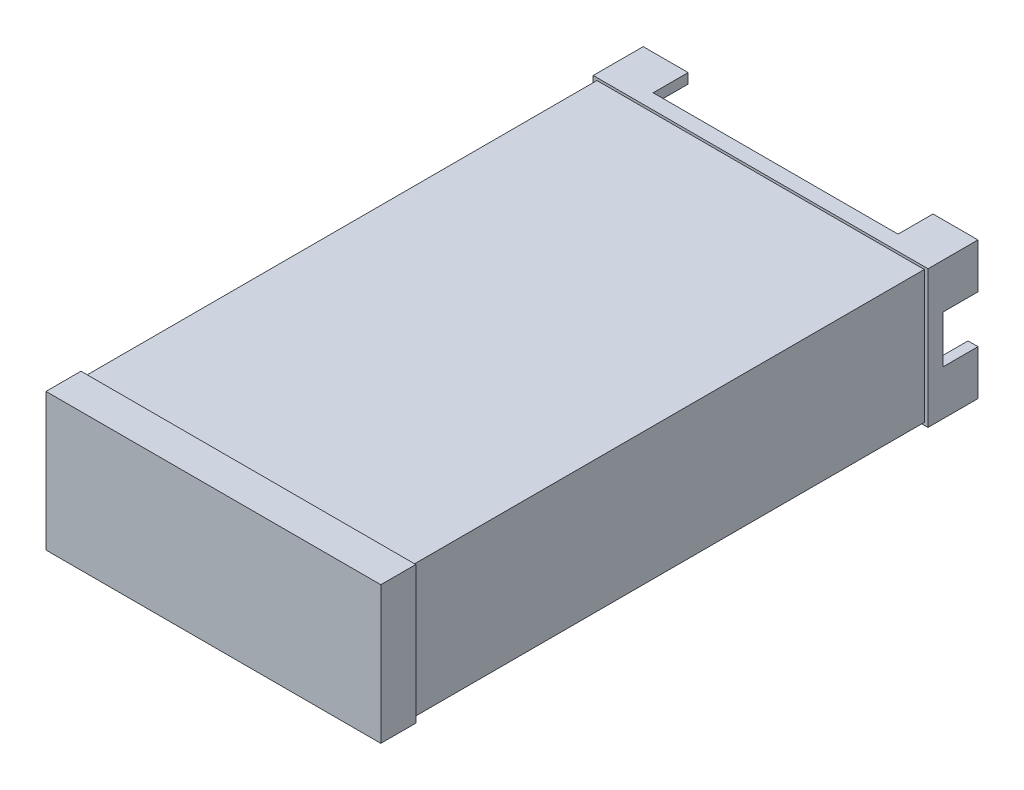
ISO-10303-21;
HEADER;
FILE_DESCRIPTION(('STEP AP214'),'2;1');
FILE_NAME('part.step','',(''),(''),'','','');
FILE_SCHEMA(('AUTOMOTIVE_DESIGN { 1 0 10303 214 1 1 1 1 }'));
ENDSEC;
DATA;
#1=APPLICATION_CONTEXT('core data for automotive mechanical design processes');
#2=APPLICATION_PROTOCOL_DEFINITION('international standard','automotive_design',2000,#1);
#3=PRODUCT_CONTEXT('',#1,'mechanical');
#4=PRODUCT('Part','Part','',(#3));
#5=PRODUCT_RELATED_PRODUCT_CATEGORY('part','',(#4));
#6=PRODUCT_DEFINITION_FORMATION('','',#4);
#7=PRODUCT_DEFINITION_CONTEXT('part definition',#1,'design');
#8=PRODUCT_DEFINITION('design','',#6,#7);
#9=PRODUCT_DEFINITION_SHAPE('','',#8);
#10=(LENGTH_UNIT() NAMED_UNIT(*) SI_UNIT(.MILLI.,.METRE.));
#11=(NAMED_UNIT(*) PLANE_ANGLE_UNIT() SI_UNIT($,.RADIAN.));
#12=(NAMED_UNIT(*) SI_UNIT($,.STERADIAN.) SOLID_ANGLE_UNIT());
#13=UNCERTAINTY_MEASURE_WITH_UNIT(LENGTH_MEASURE(1.E-05),#10,'distance_accuracy_value','');
#14=(GEOMETRIC_REPRESENTATION_CONTEXT(3) GLOBAL_UNCERTAINTY_ASSIGNED_CONTEXT((#13)) GLOBAL_UNIT_ASSIGNED_CONTEXT((#10,
#11,#12)) REPRESENTATION_CONTEXT('',''));
#15=CARTESIAN_POINT('',(0.,0.,0.));
#16=DIRECTION('',(0.,0.,1.));
#17=DIRECTION('',(1.,0.,0.));
#18=AXIS2_PLACEMENT_3D('',#15,#16,#17);
#19=CARTESIAN_POINT('',(203.99375,4.7625,-9.525));
#20=DIRECTION('',(-1.,0.,0.));
#21=DIRECTION('',(0.,0.,1.));
#22=AXIS2_PLACEMENT_3D('',#19,#20,#21);
#23=PLANE('',#22);
#24=DIRECTION('',(0.,0.,1.));
#25=VECTOR('',#24,1.);
#26=CARTESIAN_POINT('',(203.99375,4.7625,-9.525));
#27=LINE('',#26,#25);
#28=CARTESIAN_POINT('',(203.99375,4.7625,-9.525));
#29=VERTEX_POINT('',#28);
#30=CARTESIAN_POINT('',(203.99375,4.7625,-31.75));
#31=VERTEX_POINT('',#30);
#32=EDGE_CURVE('E20',#29,#31,#27,.F.);
#33=ORIENTED_EDGE('',*,*,#32,.F.);
#34=DIRECTION('',(0.,1.,0.));
#35=VECTOR('',#34,1.);
#36=CARTESIAN_POINT('',(203.99375,0.,-9.525));
#37=LINE('',#36,#35);
#38=CARTESIAN_POINT('',(203.99375,26.9875,-9.525));
#39=VERTEX_POINT('',#38);
#40=EDGE_CURVE('E297',#39,#29,#37,.F.);
#41=ORIENTED_EDGE('',*,*,#40,.F.);
#42=DIRECTION('',(0.,0.,1.));
#43=VECTOR('',#42,1.);
#44=CARTESIAN_POINT('',(203.99375,26.9875,-9.525));
#45=LINE('',#44,#43);
#46=CARTESIAN_POINT('',(203.99375,26.9875,-31.75));
#47=VERTEX_POINT('',#46);
#48=EDGE_CURVE('E235',#47,#39,#45,.T.);
#49=ORIENTED_EDGE('',*,*,#48,.F.);
#50=DIRECTION('',(0.,1.,0.));
#51=VECTOR('',#50,1.);
#52=CARTESIAN_POINT('',(203.99375,0.,-31.75));
#53=LINE('',#52,#51);
#54=EDGE_CURVE('E242',#31,#47,#53,.T.);
#55=ORIENTED_EDGE('',*,*,#54,.F.);
#56=EDGE_LOOP('',(#33,#41,#49,#55));
#57=FACE_BOUND('',#56,.T.);
#58=ADVANCED_FACE('F17',(#57),#23,.T.);
#59=CARTESIAN_POINT('',(181.76875,4.7625,-9.525));
#60=DIRECTION('',(0.,1.,0.));
#61=DIRECTION('',(0.,0.,1.));
#62=AXIS2_PLACEMENT_3D('',#59,#60,#61);
#63=PLANE('',#62);
#64=DIRECTION('',(0.,0.,1.));
#65=VECTOR('',#64,1.);
#66=CARTESIAN_POINT('',(181.76875,4.7625,-9.525));
#67=LINE('',#66,#65);
#68=CARTESIAN_POINT('',(181.76875,4.7625,-9.525));
#69=VERTEX_POINT('',#68);
#70=CARTESIAN_POINT('',(181.76875,4.7625,-31.75));
#71=VERTEX_POINT('',#70);
#72=EDGE_CURVE('E227',#69,#71,#67,.F.);
#73=ORIENTED_EDGE('',*,*,#72,.F.);
#74=DIRECTION('',(-1.,0.,0.));
#75=VECTOR('',#74,1.);
#76=CARTESIAN_POINT('',(0.,4.7625,-9.525));
#77=LINE('',#76,#75);
#78=EDGE_CURVE('E392',#29,#69,#77,.T.);
#79=ORIENTED_EDGE('',*,*,#78,.F.);
#80=ORIENTED_EDGE('',*,*,#32,.T.);
#81=DIRECTION('',(-1.,0.,0.));
#82=VECTOR('',#81,1.);
#83=CARTESIAN_POINT('',(0.,4.7625,-31.75));
#84=LINE('',#83,#82);
#85=EDGE_CURVE('E238',#71,#31,#84,.F.);
#86=ORIENTED_EDGE('',*,*,#85,.F.);
#87=EDGE_LOOP('',(#73,#79,#80,#86));
#88=FACE_BOUND('',#87,.T.);
#89=ADVANCED_FACE('F239',(#88),#63,.T.);
#90=CARTESIAN_POINT('',(3.96875,4.7625,-9.525));
#91=DIRECTION('',(0.,1.,0.));
#92=DIRECTION('',(0.,0.,1.));
#93=AXIS2_PLACEMENT_3D('',#90,#91,#92);
#94=PLANE('',#93);
#95=DIRECTION('',(0.,0.,-1.));
#96=VECTOR('',#95,1.);
#97=CARTESIAN_POINT('',(3.96875,4.7625,-9.525));
#98=LINE('',#97,#96);
#99=CARTESIAN_POINT('',(3.96875,4.7625,-9.525));
#100=VERTEX_POINT('',#99);
#101=CARTESIAN_POINT('',(3.96875,4.7625,-31.75));
#102=VERTEX_POINT('',#101);
#103=EDGE_CURVE('E257',#100,#102,#98,.T.);
#104=ORIENTED_EDGE('',*,*,#103,.F.);
#105=DIRECTION('',(-1.,0.,0.));
#106=VECTOR('',#105,1.);
#107=CARTESIAN_POINT('',(0.,4.7625,-9.525));
#108=LINE('',#107,#106);
#109=CARTESIAN_POINT('',(26.19375,4.7625,-9.525));
#110=VERTEX_POINT('',#109);
#111=EDGE_CURVE('E386',#110,#100,#108,.T.);
#112=ORIENTED_EDGE('',*,*,#111,.F.);
#113=DIRECTION('',(0.,0.,-1.));
#114=VECTOR('',#113,1.);
#115=CARTESIAN_POINT('',(26.19375,4.7625,-9.525));
#116=LINE('',#115,#114);
#117=CARTESIAN_POINT('',(26.19375,4.7625,-31.75));
#118=VERTEX_POINT('',#117);
#119=EDGE_CURVE('E274',#118,#110,#116,.F.);
#120=ORIENTED_EDGE('',*,*,#119,.F.);
#121=DIRECTION('',(-1.,0.,0.));
#122=VECTOR('',#121,1.);
#123=CARTESIAN_POINT('',(0.,4.7625,-31.75));
#124=LINE('',#123,#122);
#125=EDGE_CURVE('E272',#102,#118,#124,.F.);
#126=ORIENTED_EDGE('',*,*,#125,.F.);
#127=EDGE_LOOP('',(#104,#112,#120,#126));
#128=FACE_BOUND('',#127,.T.);
#129=ADVANCED_FACE('F273',(#128),#94,.T.);
#130=CARTESIAN_POINT('',(3.96875,26.9875,-9.525));
#131=DIRECTION('',(1.,0.,0.));
#132=DIRECTION('',(0.,0.,-1.));
#133=AXIS2_PLACEMENT_3D('',#130,#131,#132);
#134=PLANE('',#133);
#135=DIRECTION('',(0.,0.,1.));
#136=VECTOR('',#135,1.);
#137=CARTESIAN_POINT('',(3.96875,26.9875,-9.525));
#138=LINE('',#137,#136);
#139=CARTESIAN_POINT('',(3.96875,26.9875,-9.525));
#140=VERTEX_POINT('',#139);
#141=CARTESIAN_POINT('',(3.96875,26.9875,-31.75));
#142=VERTEX_POINT('',#141);
#143=EDGE_CURVE('E283',#140,#142,#138,.F.);
#144=ORIENTED_EDGE('',*,*,#143,.F.);
#145=DIRECTION('',(0.,1.,0.));
#146=VECTOR('',#145,1.);
#147=CARTESIAN_POINT('',(3.96875,0.,-9.525));
#148=LINE('',#147,#146);
#149=EDGE_CURVE('E267',#100,#140,#148,.T.);
#150=ORIENTED_EDGE('',*,*,#149,.F.);
#151=ORIENTED_EDGE('',*,*,#103,.T.);
#152=DIRECTION('',(0.,1.,0.));
#153=VECTOR('',#152,1.);
#154=CARTESIAN_POINT('',(3.96875,0.,-31.75));
#155=LINE('',#154,#153);
#156=EDGE_CURVE('E264',#142,#102,#155,.F.);
#157=ORIENTED_EDGE('',*,*,#156,.F.);
#158=EDGE_LOOP('',(#144,#150,#151,#157));
#159=FACE_BOUND('',#158,.T.);
#160=ADVANCED_FACE('F262',(#159),#134,.T.);
#161=CARTESIAN_POINT('',(203.99375,79.375,-9.525));
#162=DIRECTION('',(0.,-1.,0.));
#163=DIRECTION('',(0.,0.,-1.));
#164=AXIS2_PLACEMENT_3D('',#161,#162,#163);
#165=PLANE('',#164);
#166=DIRECTION('',(0.,0.,1.));
#167=VECTOR('',#166,1.);
#168=CARTESIAN_POINT('',(203.99375,79.375,-9.525));
#169=LINE('',#168,#167);
#170=CARTESIAN_POINT('',(203.99375,79.375,-9.525));
#171=VERTEX_POINT('',#170);
#172=CARTESIAN_POINT('',(203.99375,79.375,-31.75));
#173=VERTEX_POINT('',#172);
#174=EDGE_CURVE('E256',#171,#173,#169,.F.);
#175=ORIENTED_EDGE('',*,*,#174,.F.);
#176=DIRECTION('',(-1.,0.,0.));
#177=VECTOR('',#176,1.);
#178=CARTESIAN_POINT('',(0.,79.375,-9.525));
#179=LINE('',#178,#177);
#180=CARTESIAN_POINT('',(181.76875,79.375,-9.525));
#181=VERTEX_POINT('',#180);
#182=EDGE_CURVE('E368',#181,#171,#179,.F.);
#183=ORIENTED_EDGE('',*,*,#182,.F.);
#184=DIRECTION('',(0.,0.,1.));
#185=VECTOR('',#184,1.);
#186=CARTESIAN_POINT('',(181.76875,79.375,-9.525));
#187=LINE('',#186,#185);
#188=CARTESIAN_POINT('',(181.76875,79.375,-31.75));
#189=VERTEX_POINT('',#188);
#190=EDGE_CURVE('E396',#189,#181,#187,.T.);
#191=ORIENTED_EDGE('',*,*,#190,.F.);
#192=DIRECTION('',(-1.,0.,0.));
#193=VECTOR('',#192,1.);
#194=CARTESIAN_POINT('',(0.,79.375,-31.75));
#195=LINE('',#194,#193);
#196=EDGE_CURVE('E401',#173,#189,#195,.T.);
#197=ORIENTED_EDGE('',*,*,#196,.F.);
#198=EDGE_LOOP('',(#175,#183,#191,#197));
#199=FACE_BOUND('',#198,.T.);
#200=ADVANCED_FACE('F548',(#199),#165,.T.);
#201=CARTESIAN_POINT('',(203.99375,57.15,-9.525));
#202=DIRECTION('',(-1.,0.,0.));
#203=DIRECTION('',(0.,0.,1.));
#204=AXIS2_PLACEMENT_3D('',#201,#202,#203);
#205=PLANE('',#204);
#206=DIRECTION('',(0.,0.,-1.));
#207=VECTOR('',#206,1.);
#208=CARTESIAN_POINT('',(203.99375,57.15,-9.525));
#209=LINE('',#208,#207);
#210=CARTESIAN_POINT('',(203.99375,57.15,-9.525));
#211=VERTEX_POINT('',#210);
#212=CARTESIAN_POINT('',(203.99375,57.15,-31.75));
#213=VERTEX_POINT('',#212);
#214=EDGE_CURVE('E252',#211,#213,#209,.T.);
#215=ORIENTED_EDGE('',*,*,#214,.F.);
#216=DIRECTION('',(0.,1.,0.));
#217=VECTOR('',#216,1.);
#218=CARTESIAN_POINT('',(203.99375,0.,-9.525));
#219=LINE('',#218,#217);
#220=EDGE_CURVE('E365',#171,#211,#219,.F.);
#221=ORIENTED_EDGE('',*,*,#220,.F.);
#222=ORIENTED_EDGE('',*,*,#174,.T.);
#223=DIRECTION('',(0.,1.,0.));
#224=VECTOR('',#223,1.);
#225=CARTESIAN_POINT('',(203.99375,0.,-31.75));
#226=LINE('',#225,#224);
#227=EDGE_CURVE('E403',#213,#173,#226,.T.);
#228=ORIENTED_EDGE('',*,*,#227,.F.);
#229=EDGE_LOOP('',(#215,#221,#222,#228));
#230=FACE_BOUND('',#229,.T.);
#231=ADVANCED_FACE('F550',(#230),#205,.T.);
#232=CARTESIAN_POINT('',(26.19375,79.375,-9.525));
#233=DIRECTION('',(0.,-1.,0.));
#234=DIRECTION('',(0.,0.,-1.));
#235=AXIS2_PLACEMENT_3D('',#232,#233,#234);
#236=PLANE('',#235);
#237=DIRECTION('',(0.,0.,-1.));
#238=VECTOR('',#237,1.);
#239=CARTESIAN_POINT('',(26.19375,79.375,-9.525));
#240=LINE('',#239,#238);
#241=CARTESIAN_POINT('',(26.19375,79.375,-9.525));
#242=VERTEX_POINT('',#241);
#243=CARTESIAN_POINT('',(26.19375,79.375,-31.75));
#244=VERTEX_POINT('',#243);
#245=EDGE_CURVE('E360',#242,#244,#240,.T.);
#246=ORIENTED_EDGE('',*,*,#245,.F.);
#247=DIRECTION('',(-1.,0.,0.));
#248=VECTOR('',#247,1.);
#249=CARTESIAN_POINT('',(0.,79.375,-9.525));
#250=LINE('',#249,#248);
#251=CARTESIAN_POINT('',(3.96875,79.375,-9.525));
#252=VERTEX_POINT('',#251);
#253=EDGE_CURVE('E374',#252,#242,#250,.F.);
#254=ORIENTED_EDGE('',*,*,#253,.F.);
#255=DIRECTION('',(0.,0.,-1.));
#256=VECTOR('',#255,1.);
#257=CARTESIAN_POINT('',(3.96875,79.375,-9.525));
#258=LINE('',#257,#256);
#259=CARTESIAN_POINT('',(3.96875,79.375,-31.75));
#260=VERTEX_POINT('',#259);
#261=EDGE_CURVE('E254',#260,#252,#258,.F.);
#262=ORIENTED_EDGE('',*,*,#261,.F.);
#263=DIRECTION('',(-1.,0.,0.));
#264=VECTOR('',#263,1.);
#265=CARTESIAN_POINT('',(0.,79.375,-31.75));
#266=LINE('',#265,#264);
#267=EDGE_CURVE('E351',#244,#260,#266,.T.);
#268=ORIENTED_EDGE('',*,*,#267,.F.);
#269=EDGE_LOOP('',(#246,#254,#262,#268));
#270=FACE_BOUND('',#269,.T.);
#271=ADVANCED_FACE('F535',(#270),#236,.T.);
#272=CARTESIAN_POINT('',(3.96875,79.375,-9.525));
#273=DIRECTION('',(1.,0.,0.));
#274=DIRECTION('',(0.,0.,-1.));
#275=AXIS2_PLACEMENT_3D('',#272,#273,#274);
#276=PLANE('',#275);
#277=ORIENTED_EDGE('',*,*,#261,.T.);
#278=DIRECTION('',(0.,1.,0.));
#279=VECTOR('',#278,1.);
#280=CARTESIAN_POINT('',(3.96875,0.,-9.525));
#281=LINE('',#280,#279);
#282=CARTESIAN_POINT('',(3.96875,57.15,-9.525));
#283=VERTEX_POINT('',#282);
#284=EDGE_CURVE('E377',#283,#252,#281,.T.);
#285=ORIENTED_EDGE('',*,*,#284,.F.);
#286=DIRECTION('',(0.,0.,-1.));
#287=VECTOR('',#286,1.);
#288=CARTESIAN_POINT('',(3.96875,57.15,-9.525));
#289=LINE('',#288,#287);
#290=CARTESIAN_POINT('',(3.96875,57.15,-31.75));
#291=VERTEX_POINT('',#290);
#292=EDGE_CURVE('E288',#291,#283,#289,.F.);
#293=ORIENTED_EDGE('',*,*,#292,.F.);
#294=DIRECTION('',(0.,1.,0.));
#295=VECTOR('',#294,1.);
#296=CARTESIAN_POINT('',(3.96875,0.,-31.75));
#297=LINE('',#296,#295);
#298=EDGE_CURVE('E348',#260,#291,#297,.F.);
#299=ORIENTED_EDGE('',*,*,#298,.F.);
#300=EDGE_LOOP('',(#277,#285,#293,#299));
#301=FACE_BOUND('',#300,.T.);
#302=ADVANCED_FACE('F531',(#301),#276,.T.);
#303=CARTESIAN_POINT('',(0.,0.,347.6752));
#304=DIRECTION('',(0.,0.,1.));
#305=DIRECTION('',(1.,0.,0.));
#306=AXIS2_PLACEMENT_3D('',#303,#304,#305);
#307=PLANE('',#306);
#308=DIRECTION('',(1.,0.,0.));
#309=VECTOR('',#308,1.);
#310=CARTESIAN_POINT('',(210.34375,85.725,347.6752));
#311=LINE('',#310,#309);
#312=CARTESIAN_POINT('',(-2.38124999999999,85.725,347.6752));
#313=VERTEX_POINT('',#312);
#314=CARTESIAN_POINT('',(210.34375,85.725,347.6752));
#315=VERTEX_POINT('',#314);
#316=EDGE_CURVE('E326',#313,#315,#311,.T.);
#317=ORIENTED_EDGE('',*,*,#316,.F.);
#318=DIRECTION('',(0.,1.,0.));
#319=VECTOR('',#318,1.);
#320=CARTESIAN_POINT('',(-2.38124999999998,85.725,347.6752));
#321=LINE('',#320,#319);
#322=CARTESIAN_POINT('',(-2.38124999999999,-1.5875,347.6752));
#323=VERTEX_POINT('',#322);
#324=EDGE_CURVE('E344',#323,#313,#321,.T.);
#325=ORIENTED_EDGE('',*,*,#324,.F.);
#326=DIRECTION('',(1.,0.,0.));
#327=VECTOR('',#326,1.);
#328=CARTESIAN_POINT('',(-2.38124999999998,-1.58749999999999,347.6752));
#329=LINE('',#328,#327);
#330=CARTESIAN_POINT('',(210.34375,-1.5875,347.6752));
#331=VERTEX_POINT('',#330);
#332=EDGE_CURVE('E341',#331,#323,#329,.F.);
#333=ORIENTED_EDGE('',*,*,#332,.F.);
#334=DIRECTION('',(0.,1.,0.));
#335=VECTOR('',#334,1.);
#336=CARTESIAN_POINT('',(210.34375,-1.58749999999999,347.6752));
#337=LINE('',#336,#335);
#338=EDGE_CURVE('E335',#315,#331,#337,.F.);
#339=ORIENTED_EDGE('',*,*,#338,.F.);
#340=EDGE_LOOP('',(#317,#325,#333,#339));
#341=FACE_BOUND('',#340,.T.);
#342=ADVANCED_FACE('F638',(#341),#307,.T.);
#343=CARTESIAN_POINT('',(210.34375,57.15,-9.525));
#344=DIRECTION('',(0.,-1.,0.));
#345=DIRECTION('',(0.,0.,-1.));
#346=AXIS2_PLACEMENT_3D('',#343,#344,#345);
#347=PLANE('',#346);
#348=DIRECTION('',(0.,0.,-1.));
#349=VECTOR('',#348,1.);
#350=CARTESIAN_POINT('',(210.34375,57.15,0.));
#351=LINE('',#350,#349);
#352=CARTESIAN_POINT('',(210.34375,57.15,-9.525));
#353=VERTEX_POINT('',#352);
#354=CARTESIAN_POINT('',(210.34375,57.15,-31.75));
#355=VERTEX_POINT('',#354);
#356=EDGE_CURVE('E317',#353,#355,#351,.T.);
#357=ORIENTED_EDGE('',*,*,#356,.F.);
#358=DIRECTION('',(-1.,0.,0.));
#359=VECTOR('',#358,1.);
#360=CARTESIAN_POINT('',(0.,57.15,-9.525));
#361=LINE('',#360,#359);
#362=EDGE_CURVE('E362',#211,#353,#361,.F.);
#363=ORIENTED_EDGE('',*,*,#362,.F.);
#364=ORIENTED_EDGE('',*,*,#214,.T.);
#365=DIRECTION('',(-1.,0.,0.));
#366=VECTOR('',#365,1.);
#367=CARTESIAN_POINT('',(0.,57.15,-31.75));
#368=LINE('',#367,#366);
#369=EDGE_CURVE('E406',#355,#213,#368,.T.);
#370=ORIENTED_EDGE('',*,*,#369,.F.);
#371=EDGE_LOOP('',(#357,#363,#364,#370));
#372=FACE_BOUND('',#371,.T.);
#373=ADVANCED_FACE('F436',(#372),#347,.T.);
#374=CARTESIAN_POINT('',(203.99375,26.9875,-9.525));
#375=DIRECTION('',(0.,1.,0.));
#376=DIRECTION('',(0.,0.,1.));
#377=AXIS2_PLACEMENT_3D('',#374,#375,#376);
#378=PLANE('',#377);
#379=ORIENTED_EDGE('',*,*,#48,.T.);
#380=DIRECTION('',(-1.,0.,0.));
#381=VECTOR('',#380,1.);
#382=CARTESIAN_POINT('',(0.,26.9875,-9.525));
#383=LINE('',#382,#381);
#384=CARTESIAN_POINT('',(210.34375,26.9875,-9.525));
#385=VERTEX_POINT('',#384);
#386=EDGE_CURVE('E304',#385,#39,#383,.T.);
#387=ORIENTED_EDGE('',*,*,#386,.F.);
#388=DIRECTION('',(0.,0.,-1.));
#389=VECTOR('',#388,1.);
#390=CARTESIAN_POINT('',(210.34375,26.9875,0.));
#391=LINE('',#390,#389);
#392=CARTESIAN_POINT('',(210.34375,26.9875,-31.75));
#393=VERTEX_POINT('',#392);
#394=EDGE_CURVE('E302',#393,#385,#391,.F.);
#395=ORIENTED_EDGE('',*,*,#394,.F.);
#396=DIRECTION('',(-1.,0.,0.));
#397=VECTOR('',#396,1.);
#398=CARTESIAN_POINT('',(0.,26.9875,-31.75));
#399=LINE('',#398,#397);
#400=EDGE_CURVE('E291',#47,#393,#399,.F.);
#401=ORIENTED_EDGE('',*,*,#400,.F.);
#402=EDGE_LOOP('',(#379,#387,#395,#401));
#403=FACE_BOUND('',#402,.T.);
#404=ADVANCED_FACE('F300',(#403),#378,.T.);
#405=CARTESIAN_POINT('',(181.76875,-1.5875,-9.525));
#406=DIRECTION('',(-1.,0.,0.));
#407=DIRECTION('',(0.,0.,1.));
#408=AXIS2_PLACEMENT_3D('',#405,#406,#407);
#409=PLANE('',#408);
#410=DIRECTION('',(0.,0.,-1.));
#411=VECTOR('',#410,1.);
#412=CARTESIAN_POINT('',(181.76875,-1.58749999999999,0.));
#413=LINE('',#412,#411);
#414=CARTESIAN_POINT('',(181.76875,-1.5875,-9.525));
#415=VERTEX_POINT('',#414);
#416=CARTESIAN_POINT('',(181.76875,-1.5875,-31.75));
#417=VERTEX_POINT('',#416);
#418=EDGE_CURVE('E430',#415,#417,#413,.T.);
#419=ORIENTED_EDGE('',*,*,#418,.F.);
#420=DIRECTION('',(0.,1.,0.));
#421=VECTOR('',#420,1.);
#422=CARTESIAN_POINT('',(181.76875,0.,-9.525));
#423=LINE('',#422,#421);
#424=EDGE_CURVE('E233',#69,#415,#423,.F.);
#425=ORIENTED_EDGE('',*,*,#424,.F.);
#426=ORIENTED_EDGE('',*,*,#72,.T.);
#427=DIRECTION('',(0.,1.,0.));
#428=VECTOR('',#427,1.);
#429=CARTESIAN_POINT('',(181.76875,0.,-31.75));
#430=LINE('',#429,#428);
#431=EDGE_CURVE('E230',#417,#71,#430,.T.);
#432=ORIENTED_EDGE('',*,*,#431,.F.);
#433=EDGE_LOOP('',(#419,#425,#426,#432));
#434=FACE_BOUND('',#433,.T.);
#435=ADVANCED_FACE('F228',(#434),#409,.T.);
#436=CARTESIAN_POINT('',(0.,0.,-31.75));
#437=DIRECTION('',(0.,0.,-1.));
#438=DIRECTION('',(-1.,0.,0.));
#439=AXIS2_PLACEMENT_3D('',#436,#437,#438);
#440=PLANE('',#439);
#441=DIRECTION('',(0.,1.,0.));
#442=VECTOR('',#441,1.);
#443=CARTESIAN_POINT('',(210.34375,85.725,-31.75));
#444=LINE('',#443,#442);
#445=CARTESIAN_POINT('',(210.34375,-1.5875,-31.75));
#446=VERTEX_POINT('',#445);
#447=EDGE_CURVE('E309',#446,#393,#444,.T.);
#448=ORIENTED_EDGE('',*,*,#447,.F.);
#449=DIRECTION('',(1.,0.,0.));
#450=VECTOR('',#449,1.);
#451=CARTESIAN_POINT('',(210.34375,-1.58749999999999,-31.75));
#452=LINE('',#451,#450);
#453=EDGE_CURVE('E246',#417,#446,#452,.T.);
#454=ORIENTED_EDGE('',*,*,#453,.F.);
#455=ORIENTED_EDGE('',*,*,#431,.T.);
#456=ORIENTED_EDGE('',*,*,#85,.T.);
#457=ORIENTED_EDGE('',*,*,#54,.T.);
#458=ORIENTED_EDGE('',*,*,#400,.T.);
#459=EDGE_LOOP('',(#448,#454,#455,#456,#457,#458));
#460=FACE_BOUND('',#459,.T.);
#461=ADVANCED_FACE('F244',(#460),#440,.T.);
#462=CARTESIAN_POINT('',(26.19375,4.7625,-9.525));
#463=DIRECTION('',(1.,0.,0.));
#464=DIRECTION('',(0.,0.,-1.));
#465=AXIS2_PLACEMENT_3D('',#462,#463,#464);
#466=PLANE('',#465);
#467=ORIENTED_EDGE('',*,*,#119,.T.);
#468=DIRECTION('',(0.,1.,0.));
#469=VECTOR('',#468,1.);
#470=CARTESIAN_POINT('',(26.19375,0.,-9.525));
#471=LINE('',#470,#469);
#472=CARTESIAN_POINT('',(26.19375,-1.5875,-9.525));
#473=VERTEX_POINT('',#472);
#474=EDGE_CURVE('E388',#473,#110,#471,.T.);
#475=ORIENTED_EDGE('',*,*,#474,.F.);
#476=DIRECTION('',(0.,0.,-1.));
#477=VECTOR('',#476,1.);
#478=CARTESIAN_POINT('',(26.19375,-1.58749999999999,0.));
#479=LINE('',#478,#477);
#480=CARTESIAN_POINT('',(26.19375,-1.5875,-31.75));
#481=VERTEX_POINT('',#480);
#482=EDGE_CURVE('E414',#481,#473,#479,.F.);
#483=ORIENTED_EDGE('',*,*,#482,.F.);
#484=DIRECTION('',(0.,1.,0.));
#485=VECTOR('',#484,1.);
#486=CARTESIAN_POINT('',(26.19375,0.,-31.75));
#487=LINE('',#486,#485);
#488=EDGE_CURVE('E277',#118,#481,#487,.F.);
#489=ORIENTED_EDGE('',*,*,#488,.F.);
#490=EDGE_LOOP('',(#467,#475,#483,#489));
#491=FACE_BOUND('',#490,.T.);
#492=ADVANCED_FACE('F415',(#491),#466,.T.);
#493=CARTESIAN_POINT('',(3.96875,57.15,-9.525));
#494=DIRECTION('',(0.,-1.,0.));
#495=DIRECTION('',(0.,0.,-1.));
#496=AXIS2_PLACEMENT_3D('',#493,#494,#495);
#497=PLANE('',#496);
#498=ORIENTED_EDGE('',*,*,#292,.T.);
#499=DIRECTION('',(-1.,0.,0.));
#500=VECTOR('',#499,1.);
#501=CARTESIAN_POINT('',(0.,57.15,-9.525));
#502=LINE('',#501,#500);
#503=CARTESIAN_POINT('',(-2.38124999999999,57.15,-9.525));
#504=VERTEX_POINT('',#503);
#505=EDGE_CURVE('E380',#504,#283,#502,.F.);
#506=ORIENTED_EDGE('',*,*,#505,.F.);
#507=DIRECTION('',(0.,0.,1.));
#508=VECTOR('',#507,1.);
#509=CARTESIAN_POINT('',(-2.38124999999998,57.15,0.));
#510=LINE('',#509,#508);
#511=CARTESIAN_POINT('',(-2.38125,57.15,-31.75));
#512=VERTEX_POINT('',#511);
#513=EDGE_CURVE('E512',#512,#504,#510,.T.);
#514=ORIENTED_EDGE('',*,*,#513,.F.);
#515=DIRECTION('',(-1.,0.,0.));
#516=VECTOR('',#515,1.);
#517=CARTESIAN_POINT('',(0.,57.15,-31.75));
#518=LINE('',#517,#516);
#519=EDGE_CURVE('E346',#291,#512,#518,.T.);
#520=ORIENTED_EDGE('',*,*,#519,.F.);
#521=EDGE_LOOP('',(#498,#506,#514,#520));
#522=FACE_BOUND('',#521,.T.);
#523=ADVANCED_FACE('F527',(#522),#497,.T.);
#524=CARTESIAN_POINT('',(-2.38125,26.9875,-9.525));
#525=DIRECTION('',(0.,1.,0.));
#526=DIRECTION('',(0.,0.,1.));
#527=AXIS2_PLACEMENT_3D('',#524,#525,#526);
#528=PLANE('',#527);
#529=DIRECTION('',(0.,0.,1.));
#530=VECTOR('',#529,1.);
#531=CARTESIAN_POINT('',(-2.38124999999998,26.9875,0.));
#532=LINE('',#531,#530);
#533=CARTESIAN_POINT('',(-2.38124999999999,26.9875,-9.525));
#534=VERTEX_POINT('',#533);
#535=CARTESIAN_POINT('',(-2.38125,26.9875,-31.75));
#536=VERTEX_POINT('',#535);
#537=EDGE_CURVE('E506',#534,#536,#532,.F.);
#538=ORIENTED_EDGE('',*,*,#537,.F.);
#539=DIRECTION('',(-1.,0.,0.));
#540=VECTOR('',#539,1.);
#541=CARTESIAN_POINT('',(0.,26.9875,-9.525));
#542=LINE('',#541,#540);
#543=EDGE_CURVE('E383',#140,#534,#542,.T.);
#544=ORIENTED_EDGE('',*,*,#543,.F.);
#545=ORIENTED_EDGE('',*,*,#143,.T.);
#546=DIRECTION('',(-1.,0.,0.));
#547=VECTOR('',#546,1.);
#548=CARTESIAN_POINT('',(0.,26.9875,-31.75));
#549=LINE('',#548,#547);
#550=EDGE_CURVE('E281',#536,#142,#549,.F.);
#551=ORIENTED_EDGE('',*,*,#550,.F.);
#552=EDGE_LOOP('',(#538,#544,#545,#551));
#553=FACE_BOUND('',#552,.T.);
#554=ADVANCED_FACE('F521',(#553),#528,.T.);
#555=CARTESIAN_POINT('',(0.,0.,-31.75));
#556=DIRECTION('',(0.,0.,-1.));
#557=DIRECTION('',(-1.,0.,0.));
#558=AXIS2_PLACEMENT_3D('',#555,#556,#557);
#559=PLANE('',#558);
#560=DIRECTION('',(1.,0.,0.));
#561=VECTOR('',#560,1.);
#562=CARTESIAN_POINT('',(210.34375,-1.58749999999999,-31.75));
#563=LINE('',#562,#561);
#564=CARTESIAN_POINT('',(-2.38125,-1.5875,-31.75));
#565=VERTEX_POINT('',#564);
#566=EDGE_CURVE('E410',#565,#481,#563,.T.);
#567=ORIENTED_EDGE('',*,*,#566,.F.);
#568=DIRECTION('',(0.,1.,0.));
#569=VECTOR('',#568,1.);
#570=CARTESIAN_POINT('',(-2.38124999999998,-1.5875,-31.75));
#571=LINE('',#570,#569);
#572=EDGE_CURVE('E504',#536,#565,#571,.F.);
#573=ORIENTED_EDGE('',*,*,#572,.F.);
#574=ORIENTED_EDGE('',*,*,#550,.T.);
#575=ORIENTED_EDGE('',*,*,#156,.T.);
#576=ORIENTED_EDGE('',*,*,#125,.T.);
#577=ORIENTED_EDGE('',*,*,#488,.T.);
#578=EDGE_LOOP('',(#567,#573,#574,#575,#576,#577));
#579=FACE_BOUND('',#578,.T.);
#580=ADVANCED_FACE('F279',(#579),#559,.T.);
#581=CARTESIAN_POINT('',(0.,0.,-31.75));
#582=DIRECTION('',(0.,0.,-1.));
#583=DIRECTION('',(-1.,0.,0.));
#584=AXIS2_PLACEMENT_3D('',#581,#582,#583);
#585=PLANE('',#584);
#586=DIRECTION('',(1.,0.,0.));
#587=VECTOR('',#586,1.);
#588=CARTESIAN_POINT('',(-2.38125,85.725,-31.75));
#589=LINE('',#588,#587);
#590=CARTESIAN_POINT('',(210.34375,85.725,-31.75));
#591=VERTEX_POINT('',#590);
#592=CARTESIAN_POINT('',(181.76875,85.725,-31.75));
#593=VERTEX_POINT('',#592);
#594=EDGE_CURVE('E443',#591,#593,#589,.F.);
#595=ORIENTED_EDGE('',*,*,#594,.F.);
#596=DIRECTION('',(0.,1.,0.));
#597=VECTOR('',#596,1.);
#598=CARTESIAN_POINT('',(210.34375,85.725,-31.75));
#599=LINE('',#598,#597);
#600=EDGE_CURVE('E315',#355,#591,#599,.T.);
#601=ORIENTED_EDGE('',*,*,#600,.F.);
#602=ORIENTED_EDGE('',*,*,#369,.T.);
#603=ORIENTED_EDGE('',*,*,#227,.T.);
#604=ORIENTED_EDGE('',*,*,#196,.T.);
#605=DIRECTION('',(0.,1.,0.));
#606=VECTOR('',#605,1.);
#607=CARTESIAN_POINT('',(181.76875,79.375,-31.75));
#608=LINE('',#607,#606);
#609=EDGE_CURVE('E398',#593,#189,#608,.F.);
#610=ORIENTED_EDGE('',*,*,#609,.F.);
#611=EDGE_LOOP('',(#595,#601,#602,#603,#604,#610));
#612=FACE_BOUND('',#611,.T.);
#613=ADVANCED_FACE('F441',(#612),#585,.T.);
#614=CARTESIAN_POINT('',(181.76875,79.375,-9.525));
#615=DIRECTION('',(-1.,0.,0.));
#616=DIRECTION('',(0.,0.,1.));
#617=AXIS2_PLACEMENT_3D('',#614,#615,#616);
#618=PLANE('',#617);
#619=ORIENTED_EDGE('',*,*,#190,.T.);
#620=DIRECTION('',(0.,1.,0.));
#621=VECTOR('',#620,1.);
#622=CARTESIAN_POINT('',(181.76875,0.,-9.525));
#623=LINE('',#622,#621);
#624=CARTESIAN_POINT('',(181.76875,85.725,-9.525));
#625=VERTEX_POINT('',#624);
#626=EDGE_CURVE('E371',#625,#181,#623,.F.);
#627=ORIENTED_EDGE('',*,*,#626,.F.);
#628=DIRECTION('',(0.,0.,1.));
#629=VECTOR('',#628,1.);
#630=CARTESIAN_POINT('',(181.76875,85.725,0.));
#631=LINE('',#630,#629);
#632=EDGE_CURVE('E499',#593,#625,#631,.T.);
#633=ORIENTED_EDGE('',*,*,#632,.F.);
#634=ORIENTED_EDGE('',*,*,#609,.T.);
#635=EDGE_LOOP('',(#619,#627,#633,#634));
#636=FACE_BOUND('',#635,.T.);
#637=ADVANCED_FACE('F543',(#636),#618,.T.);
#638=CARTESIAN_POINT('',(0.,0.,-9.525));
#639=DIRECTION('',(0.,0.,-1.));
#640=DIRECTION('',(-1.,0.,0.));
#641=AXIS2_PLACEMENT_3D('',#638,#639,#640);
#642=PLANE('',#641);
#643=ORIENTED_EDGE('',*,*,#220,.T.);
#644=ORIENTED_EDGE('',*,*,#362,.T.);
#645=DIRECTION('',(0.,1.,0.));
#646=VECTOR('',#645,1.);
#647=CARTESIAN_POINT('',(210.34375,85.725,-9.525));
#648=LINE('',#647,#646);
#649=EDGE_CURVE('E308',#385,#353,#648,.T.);
#650=ORIENTED_EDGE('',*,*,#649,.F.);
#651=ORIENTED_EDGE('',*,*,#386,.T.);
#652=ORIENTED_EDGE('',*,*,#40,.T.);
#653=ORIENTED_EDGE('',*,*,#78,.T.);
#654=ORIENTED_EDGE('',*,*,#424,.T.);
#655=DIRECTION('',(1.,0.,0.));
#656=VECTOR('',#655,1.);
#657=CARTESIAN_POINT('',(210.34375,-1.58749999999999,-9.525));
#658=LINE('',#657,#656);
#659=EDGE_CURVE('E419',#473,#415,#658,.T.);
#660=ORIENTED_EDGE('',*,*,#659,.F.);
#661=ORIENTED_EDGE('',*,*,#474,.T.);
#662=ORIENTED_EDGE('',*,*,#111,.T.);
#663=ORIENTED_EDGE('',*,*,#149,.T.);
#664=ORIENTED_EDGE('',*,*,#543,.T.);
#665=DIRECTION('',(0.,1.,0.));
#666=VECTOR('',#665,1.);
#667=CARTESIAN_POINT('',(-2.38124999999998,-1.5875,-9.525));
#668=LINE('',#667,#666);
#669=EDGE_CURVE('E509',#504,#534,#668,.F.);
#670=ORIENTED_EDGE('',*,*,#669,.F.);
#671=ORIENTED_EDGE('',*,*,#505,.T.);
#672=ORIENTED_EDGE('',*,*,#284,.T.);
#673=ORIENTED_EDGE('',*,*,#253,.T.);
#674=DIRECTION('',(0.,1.,0.));
#675=VECTOR('',#674,1.);
#676=CARTESIAN_POINT('',(26.19375,85.725,-9.525));
#677=LINE('',#676,#675);
#678=CARTESIAN_POINT('',(26.19375,85.725,-9.525));
#679=VERTEX_POINT('',#678);
#680=EDGE_CURVE('E357',#679,#242,#677,.F.);
#681=ORIENTED_EDGE('',*,*,#680,.F.);
#682=DIRECTION('',(1.,0.,0.));
#683=VECTOR('',#682,1.);
#684=CARTESIAN_POINT('',(-2.38125,85.725,-9.525));
#685=LINE('',#684,#683);
#686=EDGE_CURVE('E496',#625,#679,#685,.F.);
#687=ORIENTED_EDGE('',*,*,#686,.F.);
#688=ORIENTED_EDGE('',*,*,#626,.T.);
#689=ORIENTED_EDGE('',*,*,#182,.T.);
#690=EDGE_LOOP('',(#643,#644,#650,#651,#652,#653,#654,#660,#661,#662,#663,#664,#670,#671,#672,
#673,#681,#687,#688,#689));
#691=FACE_BOUND('',#690,.T.);
#692=ADVANCED_FACE('F432',(#691),#642,.T.);
#693=CARTESIAN_POINT('',(26.19375,85.725,-9.525));
#694=DIRECTION('',(1.,0.,0.));
#695=DIRECTION('',(0.,0.,-1.));
#696=AXIS2_PLACEMENT_3D('',#693,#694,#695);
#697=PLANE('',#696);
#698=DIRECTION('',(0.,0.,1.));
#699=VECTOR('',#698,1.);
#700=CARTESIAN_POINT('',(26.19375,85.725,0.));
#701=LINE('',#700,#699);
#702=CARTESIAN_POINT('',(26.19375,85.725,-31.75));
#703=VERTEX_POINT('',#702);
#704=EDGE_CURVE('E493',#679,#703,#701,.F.);
#705=ORIENTED_EDGE('',*,*,#704,.F.);
#706=ORIENTED_EDGE('',*,*,#680,.T.);
#707=ORIENTED_EDGE('',*,*,#245,.T.);
#708=DIRECTION('',(0.,1.,0.));
#709=VECTOR('',#708,1.);
#710=CARTESIAN_POINT('',(26.19375,0.,-31.75));
#711=LINE('',#710,#709);
#712=EDGE_CURVE('E354',#703,#244,#711,.F.);
#713=ORIENTED_EDGE('',*,*,#712,.F.);
#714=EDGE_LOOP('',(#705,#706,#707,#713));
#715=FACE_BOUND('',#714,.T.);
#716=ADVANCED_FACE('F538',(#715),#697,.T.);
#717=CARTESIAN_POINT('',(0.,0.,-31.75));
#718=DIRECTION('',(0.,0.,-1.));
#719=DIRECTION('',(-1.,0.,0.));
#720=AXIS2_PLACEMENT_3D('',#717,#718,#719);
#721=PLANE('',#720);
#722=DIRECTION('',(0.,1.,0.));
#723=VECTOR('',#722,1.);
#724=CARTESIAN_POINT('',(-2.38124999999998,-1.5875,-31.75));
#725=LINE('',#724,#723);
#726=CARTESIAN_POINT('',(-2.38125,85.725,-31.75));
#727=VERTEX_POINT('',#726);
#728=EDGE_CURVE('E515',#727,#512,#725,.F.);
#729=ORIENTED_EDGE('',*,*,#728,.F.);
#730=DIRECTION('',(1.,0.,0.));
#731=VECTOR('',#730,1.);
#732=CARTESIAN_POINT('',(-2.38125,85.725,-31.75));
#733=LINE('',#732,#731);
#734=EDGE_CURVE('E491',#703,#727,#733,.F.);
#735=ORIENTED_EDGE('',*,*,#734,.F.);
#736=ORIENTED_EDGE('',*,*,#712,.T.);
#737=ORIENTED_EDGE('',*,*,#267,.T.);
#738=ORIENTED_EDGE('',*,*,#298,.T.);
#739=ORIENTED_EDGE('',*,*,#519,.T.);
#740=EDGE_LOOP('',(#729,#735,#736,#737,#738,#739));
#741=FACE_BOUND('',#740,.T.);
#742=ADVANCED_FACE('F609',(#741),#721,.T.);
#743=CARTESIAN_POINT('',(-2.38124999999998,85.725,325.4502));
#744=DIRECTION('',(-1.,0.,0.));
#745=DIRECTION('',(0.,0.,1.));
#746=AXIS2_PLACEMENT_3D('',#743,#744,#745);
#747=PLANE('',#746);
#748=DIRECTION('',(0.,0.,1.));
#749=VECTOR('',#748,1.);
#750=CARTESIAN_POINT('',(-2.38125,85.725,325.4502));
#751=LINE('',#750,#749);
#752=CARTESIAN_POINT('',(-2.38124999999999,85.725,325.4502));
#753=VERTEX_POINT('',#752);
#754=EDGE_CURVE('E329',#753,#313,#751,.T.);
#755=ORIENTED_EDGE('',*,*,#754,.F.);
#756=DIRECTION('',(0.,1.,0.));
#757=VECTOR('',#756,1.);
#758=CARTESIAN_POINT('',(-2.38124999999998,0.,325.4502));
#759=LINE('',#758,#757);
#760=CARTESIAN_POINT('',(-2.38124999999999,-1.5875,325.4502));
#761=VERTEX_POINT('',#760);
#762=EDGE_CURVE('E485',#753,#761,#759,.F.);
#763=ORIENTED_EDGE('',*,*,#762,.T.);
#764=DIRECTION('',(0.,0.,-1.));
#765=VECTOR('',#764,1.);
#766=CARTESIAN_POINT('',(-2.38125,-1.58749999999999,325.4502));
#767=LINE('',#766,#765);
#768=EDGE_CURVE('E338',#323,#761,#767,.T.);
#769=ORIENTED_EDGE('',*,*,#768,.F.);
#770=ORIENTED_EDGE('',*,*,#324,.T.);
#771=EDGE_LOOP('',(#755,#763,#769,#770));
#772=FACE_BOUND('',#771,.T.);
#773=ADVANCED_FACE('F605',(#772),#747,.T.);
#774=CARTESIAN_POINT('',(-2.38124999999998,-1.58749999999999,325.4502));
#775=DIRECTION('',(0.,-1.,0.));
#776=DIRECTION('',(0.,0.,-1.));
#777=AXIS2_PLACEMENT_3D('',#774,#775,#776);
#778=PLANE('',#777);
#779=ORIENTED_EDGE('',*,*,#768,.T.);
#780=DIRECTION('',(1.,0.,0.));
#781=VECTOR('',#780,1.);
#782=CARTESIAN_POINT('',(0.,-1.58749999999999,325.4502));
#783=LINE('',#782,#781);
#784=CARTESIAN_POINT('',(210.34375,-1.5875,325.4502));
#785=VERTEX_POINT('',#784);
#786=EDGE_CURVE('E483',#761,#785,#783,.T.);
#787=ORIENTED_EDGE('',*,*,#786,.T.);
#788=DIRECTION('',(0.,0.,-1.));
#789=VECTOR('',#788,1.);
#790=CARTESIAN_POINT('',(210.34375,-1.5875,325.4502));
#791=LINE('',#790,#789);
#792=EDGE_CURVE('E332',#331,#785,#791,.T.);
#793=ORIENTED_EDGE('',*,*,#792,.F.);
#794=ORIENTED_EDGE('',*,*,#332,.T.);
#795=EDGE_LOOP('',(#779,#787,#793,#794));
#796=FACE_BOUND('',#795,.T.);
#797=ADVANCED_FACE('F601',(#796),#778,.T.);
#798=CARTESIAN_POINT('',(210.34375,-1.58749999999999,325.4502));
#799=DIRECTION('',(1.,0.,0.));
#800=DIRECTION('',(0.,0.,-1.));
#801=AXIS2_PLACEMENT_3D('',#798,#799,#800);
#802=PLANE('',#801);
#803=ORIENTED_EDGE('',*,*,#792,.T.);
#804=DIRECTION('',(0.,1.,0.));
#805=VECTOR('',#804,1.);
#806=CARTESIAN_POINT('',(210.34375,0.,325.4502));
#807=LINE('',#806,#805);
#808=CARTESIAN_POINT('',(210.34375,85.725,325.4502));
#809=VERTEX_POINT('',#808);
#810=EDGE_CURVE('E481',#785,#809,#807,.T.);
#811=ORIENTED_EDGE('',*,*,#810,.T.);
#812=DIRECTION('',(0.,0.,1.));
#813=VECTOR('',#812,1.);
#814=CARTESIAN_POINT('',(210.34375,85.725,325.4502));
#815=LINE('',#814,#813);
#816=EDGE_CURVE('E323',#315,#809,#815,.F.);
#817=ORIENTED_EDGE('',*,*,#816,.F.);
#818=ORIENTED_EDGE('',*,*,#338,.T.);
#819=EDGE_LOOP('',(#803,#811,#817,#818));
#820=FACE_BOUND('',#819,.T.);
#821=ADVANCED_FACE('F597',(#820),#802,.T.);
#822=CARTESIAN_POINT('',(210.34375,85.725,325.4502));
#823=DIRECTION('',(0.,1.,0.));
#824=DIRECTION('',(0.,0.,1.));
#825=AXIS2_PLACEMENT_3D('',#822,#823,#824);
#826=PLANE('',#825);
#827=ORIENTED_EDGE('',*,*,#816,.T.);
#828=DIRECTION('',(1.,0.,0.));
#829=VECTOR('',#828,1.);
#830=CARTESIAN_POINT('',(0.,85.725,325.4502));
#831=LINE('',#830,#829);
#832=EDGE_CURVE('E478',#809,#753,#831,.F.);
#833=ORIENTED_EDGE('',*,*,#832,.T.);
#834=ORIENTED_EDGE('',*,*,#754,.T.);
#835=ORIENTED_EDGE('',*,*,#316,.T.);
#836=EDGE_LOOP('',(#827,#833,#834,#835));
#837=FACE_BOUND('',#836,.T.);
#838=ADVANCED_FACE('F594',(#837),#826,.T.);
#839=CARTESIAN_POINT('',(210.34375,85.725,0.));
#840=DIRECTION('',(1.,0.,0.));
#841=DIRECTION('',(0.,0.,-1.));
#842=AXIS2_PLACEMENT_3D('',#839,#840,#841);
#843=PLANE('',#842);
#844=ORIENTED_EDGE('',*,*,#394,.T.);
#845=ORIENTED_EDGE('',*,*,#649,.T.);
#846=ORIENTED_EDGE('',*,*,#356,.T.);
#847=ORIENTED_EDGE('',*,*,#600,.T.);
#848=DIRECTION('',(0.,0.,1.));
#849=VECTOR('',#848,1.);
#850=CARTESIAN_POINT('',(210.34375,85.725,0.));
#851=LINE('',#850,#849);
#852=CARTESIAN_POINT('',(210.34375,85.725,0.));
#853=VERTEX_POINT('',#852);
#854=EDGE_CURVE('E445',#853,#591,#851,.F.);
#855=ORIENTED_EDGE('',*,*,#854,.F.);
#856=DIRECTION('',(0.,1.,0.));
#857=VECTOR('',#856,1.);
#858=CARTESIAN_POINT('',(210.34375,0.,0.));
#859=LINE('',#858,#857);
#860=CARTESIAN_POINT('',(210.34375,-1.5875,0.));
#861=VERTEX_POINT('',#860);
#862=EDGE_CURVE('E448',#853,#861,#859,.F.);
#863=ORIENTED_EDGE('',*,*,#862,.T.);
#864=DIRECTION('',(0.,0.,-1.));
#865=VECTOR('',#864,1.);
#866=CARTESIAN_POINT('',(210.34375,-1.58749999999999,0.));
#867=LINE('',#866,#865);
#868=EDGE_CURVE('E314',#446,#861,#867,.F.);
#869=ORIENTED_EDGE('',*,*,#868,.F.);
#870=ORIENTED_EDGE('',*,*,#447,.T.);
#871=EDGE_LOOP('',(#844,#845,#846,#847,#855,#863,#869,#870));
#872=FACE_BOUND('',#871,.T.);
#873=ADVANCED_FACE('F312',(#872),#843,.T.);
#874=CARTESIAN_POINT('',(210.34375,-1.58749999999999,0.));
#875=DIRECTION('',(0.,-1.,0.));
#876=DIRECTION('',(0.,0.,-1.));
#877=AXIS2_PLACEMENT_3D('',#874,#875,#876);
#878=PLANE('',#877);
#879=ORIENTED_EDGE('',*,*,#482,.T.);
#880=ORIENTED_EDGE('',*,*,#659,.T.);
#881=ORIENTED_EDGE('',*,*,#418,.T.);
#882=ORIENTED_EDGE('',*,*,#453,.T.);
#883=ORIENTED_EDGE('',*,*,#868,.T.);
#884=DIRECTION('',(-1.,0.,0.));
#885=VECTOR('',#884,1.);
#886=CARTESIAN_POINT('',(0.,-1.58749999999999,0.));
#887=LINE('',#886,#885);
#888=CARTESIAN_POINT('',(-2.38124999999999,-1.5875,0.));
#889=VERTEX_POINT('',#888);
#890=EDGE_CURVE('E464',#861,#889,#887,.T.);
#891=ORIENTED_EDGE('',*,*,#890,.T.);
#892=DIRECTION('',(0.,0.,1.));
#893=VECTOR('',#892,1.);
#894=CARTESIAN_POINT('',(-2.38124999999998,-1.5875,0.));
#895=LINE('',#894,#893);
#896=EDGE_CURVE('E423',#565,#889,#895,.T.);
#897=ORIENTED_EDGE('',*,*,#896,.F.);
#898=ORIENTED_EDGE('',*,*,#566,.T.);
#899=EDGE_LOOP('',(#879,#880,#881,#882,#883,#891,#897,#898));
#900=FACE_BOUND('',#899,.T.);
#901=ADVANCED_FACE('F421',(#900),#878,.T.);
#902=CARTESIAN_POINT('',(-2.38124999999998,-1.5875,0.));
#903=DIRECTION('',(-1.,0.,0.));
#904=DIRECTION('',(0.,0.,1.));
#905=AXIS2_PLACEMENT_3D('',#902,#903,#904);
#906=PLANE('',#905);
#907=ORIENTED_EDGE('',*,*,#572,.T.);
#908=ORIENTED_EDGE('',*,*,#896,.T.);
#909=DIRECTION('',(0.,1.,0.));
#910=VECTOR('',#909,1.);
#911=CARTESIAN_POINT('',(-2.38124999999998,0.,0.));
#912=LINE('',#911,#910);
#913=CARTESIAN_POINT('',(-2.38124999999999,85.725,0.));
#914=VERTEX_POINT('',#913);
#915=EDGE_CURVE('E460',#889,#914,#912,.T.);
#916=ORIENTED_EDGE('',*,*,#915,.T.);
#917=DIRECTION('',(0.,0.,1.));
#918=VECTOR('',#917,1.);
#919=CARTESIAN_POINT('',(-2.38125,85.725,0.));
#920=LINE('',#919,#918);
#921=EDGE_CURVE('E457',#727,#914,#920,.T.);
#922=ORIENTED_EDGE('',*,*,#921,.F.);
#923=ORIENTED_EDGE('',*,*,#728,.T.);
#924=ORIENTED_EDGE('',*,*,#513,.T.);
#925=ORIENTED_EDGE('',*,*,#669,.T.);
#926=ORIENTED_EDGE('',*,*,#537,.T.);
#927=EDGE_LOOP('',(#907,#908,#916,#922,#923,#924,#925,#926));
#928=FACE_BOUND('',#927,.T.);
#929=ADVANCED_FACE('F523',(#928),#906,.T.);
#930=CARTESIAN_POINT('',(-2.38125,85.725,0.));
#931=DIRECTION('',(0.,1.,0.));
#932=DIRECTION('',(0.,0.,1.));
#933=AXIS2_PLACEMENT_3D('',#930,#931,#932);
#934=PLANE('',#933);
#935=ORIENTED_EDGE('',*,*,#734,.T.);
#936=ORIENTED_EDGE('',*,*,#921,.T.);
#937=DIRECTION('',(-1.,0.,0.));
#938=VECTOR('',#937,1.);
#939=CARTESIAN_POINT('',(0.,85.725,0.));
#940=LINE('',#939,#938);
#941=EDGE_CURVE('E453',#914,#853,#940,.F.);
#942=ORIENTED_EDGE('',*,*,#941,.T.);
#943=ORIENTED_EDGE('',*,*,#854,.T.);
#944=ORIENTED_EDGE('',*,*,#594,.T.);
#945=ORIENTED_EDGE('',*,*,#632,.T.);
#946=ORIENTED_EDGE('',*,*,#686,.T.);
#947=ORIENTED_EDGE('',*,*,#704,.T.);
#948=EDGE_LOOP('',(#935,#936,#942,#943,#944,#945,#946,#947));
#949=FACE_BOUND('',#948,.T.);
#950=ADVANCED_FACE('F455',(#949),#934,.T.);
#951=CARTESIAN_POINT('',(207.9625,84.1375,0.));
#952=DIRECTION('',(0.,1.,0.));
#953=DIRECTION('',(0.,0.,1.));
#954=AXIS2_PLACEMENT_3D('',#951,#952,#953);
#955=PLANE('',#954);
#956=DIRECTION('',(0.,0.,-1.));
#957=VECTOR('',#956,1.);
#958=CARTESIAN_POINT('',(207.9625,84.1375,0.));
#959=LINE('',#958,#957);
#960=CARTESIAN_POINT('',(207.9625,84.1375,0.));
#961=VERTEX_POINT('',#960);
#962=CARTESIAN_POINT('',(207.9625,84.1375,325.4502));
#963=VERTEX_POINT('',#962);
#964=EDGE_CURVE('E487',#961,#963,#959,.F.);
#965=ORIENTED_EDGE('',*,*,#964,.F.);
#966=DIRECTION('',(-1.,0.,0.));
#967=VECTOR('',#966,1.);
#968=CARTESIAN_POINT('',(0.,84.1375,0.));
#969=LINE('',#968,#967);
#970=CARTESIAN_POINT('',(0.,84.1375,0.));
#971=VERTEX_POINT('',#970);
#972=EDGE_CURVE('E921',#961,#971,#969,.T.);
#973=ORIENTED_EDGE('',*,*,#972,.T.);
#974=DIRECTION('',(0.,0.,1.));
#975=VECTOR('',#974,1.);
#976=CARTESIAN_POINT('',(0.,84.1375,0.));
#977=LINE('',#976,#975);
#978=CARTESIAN_POINT('',(0.,84.1375,325.4502));
#979=VERTEX_POINT('',#978);
#980=EDGE_CURVE('E465',#979,#971,#977,.F.);
#981=ORIENTED_EDGE('',*,*,#980,.F.);
#982=DIRECTION('',(1.,0.,0.));
#983=VECTOR('',#982,1.);
#984=CARTESIAN_POINT('',(0.,84.1375,325.4502));
#985=LINE('',#984,#983);
#986=EDGE_CURVE('E476',#979,#963,#985,.T.);
#987=ORIENTED_EDGE('',*,*,#986,.T.);
#988=EDGE_LOOP('',(#965,#973,#981,#987));
#989=FACE_BOUND('',#988,.T.);
#990=ADVANCED_FACE('F581',(#989),#955,.T.);
#991=CARTESIAN_POINT('',(207.9625,0.,0.));
#992=DIRECTION('',(1.,0.,0.));
#993=DIRECTION('',(0.,0.,-1.));
#994=AXIS2_PLACEMENT_3D('',#991,#992,#993);
#995=PLANE('',#994);
#996=DIRECTION('',(0.,0.,-1.));
#997=VECTOR('',#996,1.);
#998=CARTESIAN_POINT('',(207.9625,0.,0.));
#999=LINE('',#998,#997);
#1000=CARTESIAN_POINT('',(207.9625,0.,0.));
#1001=VERTEX_POINT('',#1000);
#1002=CARTESIAN_POINT('',(207.9625,0.,325.4502));
#1003=VERTEX_POINT('',#1002);
#1004=EDGE_CURVE('E924',#1001,#1003,#999,.F.);
#1005=ORIENTED_EDGE('',*,*,#1004,.F.);
#1006=DIRECTION('',(0.,1.,0.));
#1007=VECTOR('',#1006,1.);
#1008=CARTESIAN_POINT('',(207.9625,0.,0.));
#1009=LINE('',#1008,#1007);
#1010=EDGE_CURVE('E918',#1001,#961,#1009,.T.);
#1011=ORIENTED_EDGE('',*,*,#1010,.T.);
#1012=ORIENTED_EDGE('',*,*,#964,.T.);
#1013=DIRECTION('',(0.,1.,0.));
#1014=VECTOR('',#1013,1.);
#1015=CARTESIAN_POINT('',(207.9625,0.,325.4502));
#1016=LINE('',#1015,#1014);
#1017=EDGE_CURVE('E474',#963,#1003,#1016,.F.);
#1018=ORIENTED_EDGE('',*,*,#1017,.T.);
#1019=EDGE_LOOP('',(#1005,#1011,#1012,#1018));
#1020=FACE_BOUND('',#1019,.T.);
#1021=ADVANCED_FACE('F577',(#1020),#995,.T.);
#1022=CARTESIAN_POINT('',(0.,0.,325.4502));
#1023=DIRECTION('',(0.,0.,1.));
#1024=DIRECTION('',(1.,0.,0.));
#1025=AXIS2_PLACEMENT_3D('',#1022,#1023,#1024);
#1026=PLANE('',#1025);
#1027=ORIENTED_EDGE('',*,*,#1017,.F.);
#1028=ORIENTED_EDGE('',*,*,#986,.F.);
#1029=DIRECTION('',(0.,1.,0.));
#1030=VECTOR('',#1029,1.);
#1031=CARTESIAN_POINT('',(0.,84.1375,325.4502));
#1032=LINE('',#1031,#1030);
#1033=CARTESIAN_POINT('',(0.,0.,325.4502));
#1034=VERTEX_POINT('',#1033);
#1035=EDGE_CURVE('E468',#1034,#979,#1032,.T.);
#1036=ORIENTED_EDGE('',*,*,#1035,.F.);
#1037=DIRECTION('',(1.,0.,0.));
#1038=VECTOR('',#1037,1.);
#1039=CARTESIAN_POINT('',(0.,0.,325.4502));
#1040=LINE('',#1039,#1038);
#1041=EDGE_CURVE('E927',#1003,#1034,#1040,.F.);
#1042=ORIENTED_EDGE('',*,*,#1041,.F.);
#1043=EDGE_LOOP('',(#1027,#1028,#1036,#1042));
#1044=FACE_BOUND('',#1043,.T.);
#1045=ORIENTED_EDGE('',*,*,#810,.F.);
#1046=ORIENTED_EDGE('',*,*,#786,.F.);
#1047=ORIENTED_EDGE('',*,*,#762,.F.);
#1048=ORIENTED_EDGE('',*,*,#832,.F.);
#1049=EDGE_LOOP('',(#1045,#1046,#1047,#1048));
#1050=FACE_BOUND('',#1049,.T.);
#1051=ADVANCED_FACE('F574',(#1044,#1050),#1026,.F.);
#1052=CARTESIAN_POINT('',(0.,84.1375,0.));
#1053=DIRECTION('',(-1.,0.,0.));
#1054=DIRECTION('',(0.,0.,1.));
#1055=AXIS2_PLACEMENT_3D('',#1052,#1053,#1054);
#1056=PLANE('',#1055);
#1057=ORIENTED_EDGE('',*,*,#980,.T.);
#1058=DIRECTION('',(0.,1.,0.));
#1059=VECTOR('',#1058,1.);
#1060=CARTESIAN_POINT('',(0.,0.,0.));
#1061=LINE('',#1060,#1059);
#1062=CARTESIAN_POINT('',(0.,0.,0.));
#1063=VERTEX_POINT('',#1062);
#1064=EDGE_CURVE('E35',#971,#1063,#1061,.F.);
#1065=ORIENTED_EDGE('',*,*,#1064,.T.);
#1066=DIRECTION('',(0.,0.,-1.));
#1067=VECTOR('',#1066,1.);
#1068=CARTESIAN_POINT('',(0.,0.,0.));
#1069=LINE('',#1068,#1067);
#1070=EDGE_CURVE('E26',#1034,#1063,#1069,.T.);
#1071=ORIENTED_EDGE('',*,*,#1070,.F.);
#1072=ORIENTED_EDGE('',*,*,#1035,.T.);
#1073=EDGE_LOOP('',(#1057,#1065,#1071,#1072));
#1074=FACE_BOUND('',#1073,.T.);
#1075=ADVANCED_FACE('F567',(#1074),#1056,.T.);
#1076=CARTESIAN_POINT('',(0.,0.,0.));
#1077=DIRECTION('',(0.,0.,-1.));
#1078=DIRECTION('',(-1.,0.,0.));
#1079=AXIS2_PLACEMENT_3D('',#1076,#1077,#1078);
#1080=PLANE('',#1079);
#1081=ORIENTED_EDGE('',*,*,#1010,.F.);
#1082=DIRECTION('',(1.,0.,0.));
#1083=VECTOR('',#1082,1.);
#1084=CARTESIAN_POINT('',(0.,0.,0.));
#1085=LINE('',#1084,#1083);
#1086=EDGE_CURVE('E11',#1063,#1001,#1085,.T.);
#1087=ORIENTED_EDGE('',*,*,#1086,.F.);
#1088=ORIENTED_EDGE('',*,*,#1064,.F.);
#1089=ORIENTED_EDGE('',*,*,#972,.F.);
#1090=EDGE_LOOP('',(#1081,#1087,#1088,#1089));
#1091=FACE_BOUND('',#1090,.T.);
#1092=ORIENTED_EDGE('',*,*,#915,.F.);
#1093=ORIENTED_EDGE('',*,*,#890,.F.);
#1094=ORIENTED_EDGE('',*,*,#862,.F.);
#1095=ORIENTED_EDGE('',*,*,#941,.F.);
#1096=EDGE_LOOP('',(#1092,#1093,#1094,#1095));
#1097=FACE_BOUND('',#1096,.T.);
#1098=ADVANCED_FACE('F463',(#1091,#1097),#1080,.F.);
#1099=CARTESIAN_POINT('',(0.,0.,0.));
#1100=DIRECTION('',(0.,-1.,0.));
#1101=DIRECTION('',(0.,0.,-1.));
#1102=AXIS2_PLACEMENT_3D('',#1099,#1100,#1101);
#1103=PLANE('',#1102);
#1104=ORIENTED_EDGE('',*,*,#1070,.T.);
#1105=ORIENTED_EDGE('',*,*,#1086,.T.);
#1106=ORIENTED_EDGE('',*,*,#1004,.T.);
#1107=ORIENTED_EDGE('',*,*,#1041,.T.);
#1108=EDGE_LOOP('',(#1104,#1105,#1106,#1107));
#1109=FACE_BOUND('',#1108,.T.);
#1110=ADVANCED_FACE('F560',(#1109),#1103,.T.);
#1111=CLOSED_SHELL('',(#58,#89,#129,#160,#200,#231,#271,#302,#342,#373,#404,#435,#461,#492,#523,
#554,#580,#613,#637,#692,#716,#742,#773,#797,#821,#838,#873,#901,#929,#950,#990,#1021,#1051,
#1075,#1098,#1110));
#1112=MANIFOLD_SOLID_BREP('B1',#1111);
#1113=ADVANCED_BREP_SHAPE_REPRESENTATION('',(#18,#1112),#14);
#1114=SHAPE_DEFINITION_REPRESENTATION(#9,#1113);
ENDSEC;
END-ISO-10303-21;
